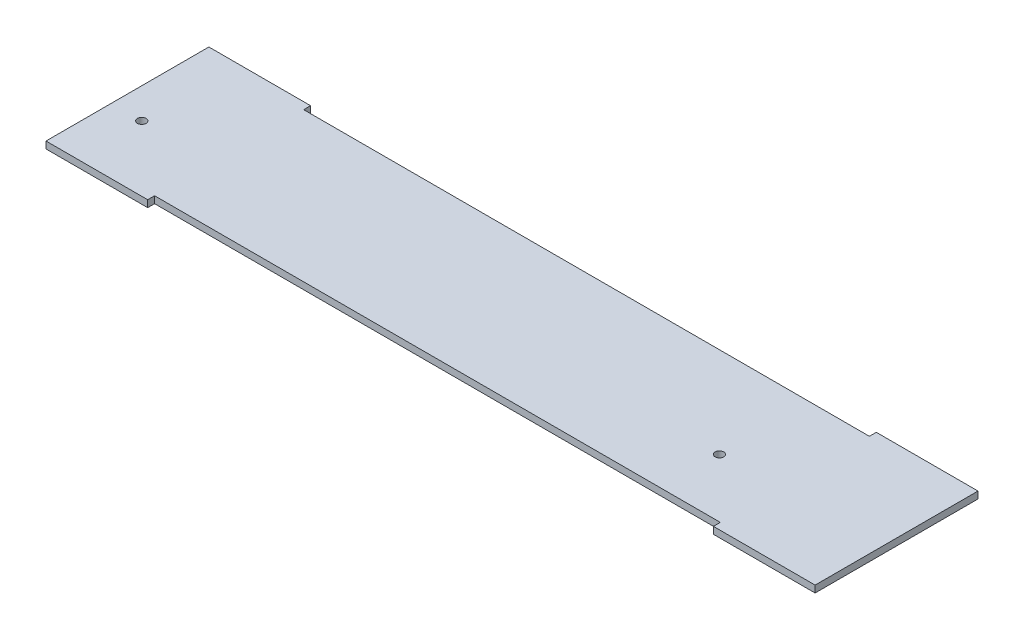
ISO-10303-21;
HEADER;
FILE_DESCRIPTION(('STEP AP214'),'2;1');
FILE_NAME('part.step','',(''),(''),'','','');
FILE_SCHEMA(('AUTOMOTIVE_DESIGN { 1 0 10303 214 1 1 1 1 }'));
ENDSEC;
DATA;
#1=APPLICATION_CONTEXT('core data for automotive mechanical design processes');
#2=APPLICATION_PROTOCOL_DEFINITION('international standard','automotive_design',2000,#1);
#3=PRODUCT_CONTEXT('',#1,'mechanical');
#4=PRODUCT('Part','Part','',(#3));
#5=PRODUCT_RELATED_PRODUCT_CATEGORY('part','',(#4));
#6=PRODUCT_DEFINITION_FORMATION('','',#4);
#7=PRODUCT_DEFINITION_CONTEXT('part definition',#1,'design');
#8=PRODUCT_DEFINITION('design','',#6,#7);
#9=PRODUCT_DEFINITION_SHAPE('','',#8);
#10=(LENGTH_UNIT() NAMED_UNIT(*) SI_UNIT(.MILLI.,.METRE.));
#11=(NAMED_UNIT(*) PLANE_ANGLE_UNIT() SI_UNIT($,.RADIAN.));
#12=(NAMED_UNIT(*) SI_UNIT($,.STERADIAN.) SOLID_ANGLE_UNIT());
#13=UNCERTAINTY_MEASURE_WITH_UNIT(LENGTH_MEASURE(1.E-05),#10,'distance_accuracy_value','');
#14=(GEOMETRIC_REPRESENTATION_CONTEXT(3) GLOBAL_UNCERTAINTY_ASSIGNED_CONTEXT((#13)) GLOBAL_UNIT_ASSIGNED_CONTEXT((#10,
#11,#12)) REPRESENTATION_CONTEXT('',''));
#15=CARTESIAN_POINT('',(0.,0.,0.));
#16=DIRECTION('',(0.,0.,1.));
#17=DIRECTION('',(1.,0.,0.));
#18=AXIS2_PLACEMENT_3D('',#15,#16,#17);
#19=CARTESIAN_POINT('',(-260.5,3.175,-74.9999999999999));
#20=DIRECTION('',(0.,0.,1.));
#21=DIRECTION('',(1.,0.,0.));
#22=AXIS2_PLACEMENT_3D('',#19,#20,#21);
#23=PLANE('',#22);
#24=DIRECTION('',(-1.,0.,0.));
#25=VECTOR('',#24,1.);
#26=CARTESIAN_POINT('',(-260.5,-3.175,-74.9999999999999));
#27=LINE('',#26,#25);
#28=CARTESIAN_POINT('',(-260.5,-3.175,-74.9999999999999));
#29=VERTEX_POINT('',#28);
#30=CARTESIAN_POINT('',(-354.15,-3.175,-75.));
#31=VERTEX_POINT('',#30);
#32=EDGE_CURVE('E153',#29,#31,#27,.T.);
#33=ORIENTED_EDGE('',*,*,#32,.T.);
#34=DIRECTION('',(0.,-1.,0.));
#35=VECTOR('',#34,1.);
#36=CARTESIAN_POINT('',(-354.15,3.175,-75.));
#37=LINE('',#36,#35);
#38=CARTESIAN_POINT('',(-354.15,3.175,-75.));
#39=VERTEX_POINT('',#38);
#40=EDGE_CURVE('E11',#39,#31,#37,.T.);
#41=ORIENTED_EDGE('',*,*,#40,.F.);
#42=DIRECTION('',(-1.,0.,0.));
#43=VECTOR('',#42,1.);
#44=CARTESIAN_POINT('',(-260.5,3.175,-74.9999999999999));
#45=LINE('',#44,#43);
#46=CARTESIAN_POINT('',(-260.5,3.175,-74.9999999999999));
#47=VERTEX_POINT('',#46);
#48=EDGE_CURVE('E176',#47,#39,#45,.T.);
#49=ORIENTED_EDGE('',*,*,#48,.F.);
#50=DIRECTION('',(0.,-1.,0.));
#51=VECTOR('',#50,1.);
#52=CARTESIAN_POINT('',(-260.5,3.175,-74.9999999999999));
#53=LINE('',#52,#51);
#54=EDGE_CURVE('E149',#47,#29,#53,.T.);
#55=ORIENTED_EDGE('',*,*,#54,.T.);
#56=EDGE_LOOP('',(#33,#41,#49,#55));
#57=FACE_BOUND('',#56,.T.);
#58=ADVANCED_FACE('F33',(#57),#23,.F.);
#59=CARTESIAN_POINT('',(-354.15,3.175,-75.));
#60=DIRECTION('',(1.,0.,0.));
#61=DIRECTION('',(0.,0.,-1.));
#62=AXIS2_PLACEMENT_3D('',#59,#60,#61);
#63=PLANE('',#62);
#64=DIRECTION('',(0.,0.,1.));
#65=VECTOR('',#64,1.);
#66=CARTESIAN_POINT('',(-354.15,-3.175,-75.));
#67=LINE('',#66,#65);
#68=CARTESIAN_POINT('',(-354.15,-3.175,75.));
#69=VERTEX_POINT('',#68);
#70=EDGE_CURVE('E156',#31,#69,#67,.T.);
#71=ORIENTED_EDGE('',*,*,#70,.T.);
#72=DIRECTION('',(0.,-1.,0.));
#73=VECTOR('',#72,1.);
#74=CARTESIAN_POINT('',(-354.15,3.175,75.));
#75=LINE('',#74,#73);
#76=CARTESIAN_POINT('',(-354.15,3.175,75.));
#77=VERTEX_POINT('',#76);
#78=EDGE_CURVE('E41',#77,#69,#75,.T.);
#79=ORIENTED_EDGE('',*,*,#78,.F.);
#80=DIRECTION('',(0.,0.,1.));
#81=VECTOR('',#80,1.);
#82=CARTESIAN_POINT('',(-354.15,3.175,-75.));
#83=LINE('',#82,#81);
#84=EDGE_CURVE('E104',#39,#77,#83,.T.);
#85=ORIENTED_EDGE('',*,*,#84,.F.);
#86=ORIENTED_EDGE('',*,*,#40,.T.);
#87=EDGE_LOOP('',(#71,#79,#85,#86));
#88=FACE_BOUND('',#87,.T.);
#89=ADVANCED_FACE('F255',(#88),#63,.F.);
#90=CARTESIAN_POINT('',(-354.15,3.175,75.));
#91=DIRECTION('',(0.,0.,-1.));
#92=DIRECTION('',(-1.,0.,0.));
#93=AXIS2_PLACEMENT_3D('',#90,#91,#92);
#94=PLANE('',#93);
#95=DIRECTION('',(1.,0.,0.));
#96=VECTOR('',#95,1.);
#97=CARTESIAN_POINT('',(-354.15,-3.175,75.));
#98=LINE('',#97,#96);
#99=CARTESIAN_POINT('',(-260.5,-3.175,74.9999999999999));
#100=VERTEX_POINT('',#99);
#101=EDGE_CURVE('E159',#69,#100,#98,.T.);
#102=ORIENTED_EDGE('',*,*,#101,.T.);
#103=DIRECTION('',(0.,-1.,0.));
#104=VECTOR('',#103,1.);
#105=CARTESIAN_POINT('',(-260.5,3.175,74.9999999999999));
#106=LINE('',#105,#104);
#107=CARTESIAN_POINT('',(-260.5,3.175,74.9999999999999));
#108=VERTEX_POINT('',#107);
#109=EDGE_CURVE('E195',#108,#100,#106,.T.);
#110=ORIENTED_EDGE('',*,*,#109,.F.);
#111=DIRECTION('',(1.,0.,0.));
#112=VECTOR('',#111,1.);
#113=CARTESIAN_POINT('',(-354.15,3.175,75.));
#114=LINE('',#113,#112);
#115=EDGE_CURVE('E203',#77,#108,#114,.T.);
#116=ORIENTED_EDGE('',*,*,#115,.F.);
#117=ORIENTED_EDGE('',*,*,#78,.T.);
#118=EDGE_LOOP('',(#102,#110,#116,#117));
#119=FACE_BOUND('',#118,.T.);
#120=ADVANCED_FACE('F201',(#119),#94,.F.);
#121=CARTESIAN_POINT('',(-260.5,3.175,74.9999999999999));
#122=DIRECTION('',(-1.,0.,0.));
#123=DIRECTION('',(0.,0.,1.));
#124=AXIS2_PLACEMENT_3D('',#121,#122,#123);
#125=PLANE('',#124);
#126=DIRECTION('',(0.,0.,-1.));
#127=VECTOR('',#126,1.);
#128=CARTESIAN_POINT('',(-260.5,-3.175,74.9999999999999));
#129=LINE('',#128,#127);
#130=CARTESIAN_POINT('',(-260.5,-3.175,68.6499999999999));
#131=VERTEX_POINT('',#130);
#132=EDGE_CURVE('E161',#100,#131,#129,.T.);
#133=ORIENTED_EDGE('',*,*,#132,.T.);
#134=DIRECTION('',(0.,-1.,0.));
#135=VECTOR('',#134,1.);
#136=CARTESIAN_POINT('',(-260.5,3.175,68.6499999999999));
#137=LINE('',#136,#135);
#138=CARTESIAN_POINT('',(-260.5,3.175,68.6499999999999));
#139=VERTEX_POINT('',#138);
#140=EDGE_CURVE('E192',#139,#131,#137,.T.);
#141=ORIENTED_EDGE('',*,*,#140,.F.);
#142=DIRECTION('',(0.,0.,-1.));
#143=VECTOR('',#142,1.);
#144=CARTESIAN_POINT('',(-260.5,3.175,74.9999999999999));
#145=LINE('',#144,#143);
#146=EDGE_CURVE('E221',#108,#139,#145,.T.);
#147=ORIENTED_EDGE('',*,*,#146,.F.);
#148=ORIENTED_EDGE('',*,*,#109,.T.);
#149=EDGE_LOOP('',(#133,#141,#147,#148));
#150=FACE_BOUND('',#149,.T.);
#151=ADVANCED_FACE('F212',(#150),#125,.F.);
#152=CARTESIAN_POINT('',(-260.5,3.175,68.6499999999999));
#153=DIRECTION('',(0.,0.,-1.));
#154=DIRECTION('',(-1.,0.,0.));
#155=AXIS2_PLACEMENT_3D('',#152,#153,#154);
#156=PLANE('',#155);
#157=DIRECTION('',(1.,0.,0.));
#158=VECTOR('',#157,1.);
#159=CARTESIAN_POINT('',(-260.5,-3.175,68.6499999999999));
#160=LINE('',#159,#158);
#161=CARTESIAN_POINT('',(260.5,-3.175,68.6499999999999));
#162=VERTEX_POINT('',#161);
#163=EDGE_CURVE('E163',#131,#162,#160,.T.);
#164=ORIENTED_EDGE('',*,*,#163,.T.);
#165=DIRECTION('',(0.,-1.,0.));
#166=VECTOR('',#165,1.);
#167=CARTESIAN_POINT('',(260.5,3.175,68.6499999999999));
#168=LINE('',#167,#166);
#169=CARTESIAN_POINT('',(260.5,3.175,68.6499999999999));
#170=VERTEX_POINT('',#169);
#171=EDGE_CURVE('E189',#170,#162,#168,.T.);
#172=ORIENTED_EDGE('',*,*,#171,.F.);
#173=DIRECTION('',(1.,0.,0.));
#174=VECTOR('',#173,1.);
#175=CARTESIAN_POINT('',(-260.5,3.175,68.6499999999999));
#176=LINE('',#175,#174);
#177=EDGE_CURVE('E218',#139,#170,#176,.T.);
#178=ORIENTED_EDGE('',*,*,#177,.F.);
#179=ORIENTED_EDGE('',*,*,#140,.T.);
#180=EDGE_LOOP('',(#164,#172,#178,#179));
#181=FACE_BOUND('',#180,.T.);
#182=ADVANCED_FACE('F216',(#181),#156,.F.);
#183=CARTESIAN_POINT('',(260.5,3.175,68.6499999999999));
#184=DIRECTION('',(1.,0.,0.));
#185=DIRECTION('',(0.,0.,-1.));
#186=AXIS2_PLACEMENT_3D('',#183,#184,#185);
#187=PLANE('',#186);
#188=DIRECTION('',(0.,0.,1.));
#189=VECTOR('',#188,1.);
#190=CARTESIAN_POINT('',(260.5,-3.175,68.6499999999999));
#191=LINE('',#190,#189);
#192=CARTESIAN_POINT('',(260.5,-3.175,74.9999999999999));
#193=VERTEX_POINT('',#192);
#194=EDGE_CURVE('E165',#162,#193,#191,.T.);
#195=ORIENTED_EDGE('',*,*,#194,.T.);
#196=DIRECTION('',(0.,-1.,0.));
#197=VECTOR('',#196,1.);
#198=CARTESIAN_POINT('',(260.5,3.175,74.9999999999999));
#199=LINE('',#198,#197);
#200=CARTESIAN_POINT('',(260.5,3.175,74.9999999999999));
#201=VERTEX_POINT('',#200);
#202=EDGE_CURVE('E186',#201,#193,#199,.T.);
#203=ORIENTED_EDGE('',*,*,#202,.F.);
#204=DIRECTION('',(0.,0.,1.));
#205=VECTOR('',#204,1.);
#206=CARTESIAN_POINT('',(260.5,3.175,68.6499999999999));
#207=LINE('',#206,#205);
#208=EDGE_CURVE('E220',#170,#201,#207,.T.);
#209=ORIENTED_EDGE('',*,*,#208,.F.);
#210=ORIENTED_EDGE('',*,*,#171,.T.);
#211=EDGE_LOOP('',(#195,#203,#209,#210));
#212=FACE_BOUND('',#211,.T.);
#213=ADVANCED_FACE('F268',(#212),#187,.F.);
#214=CARTESIAN_POINT('',(260.5,3.175,74.9999999999999));
#215=DIRECTION('',(0.,0.,-1.));
#216=DIRECTION('',(-1.,0.,0.));
#217=AXIS2_PLACEMENT_3D('',#214,#215,#216);
#218=PLANE('',#217);
#219=DIRECTION('',(1.,0.,0.));
#220=VECTOR('',#219,1.);
#221=CARTESIAN_POINT('',(260.5,-3.175,74.9999999999999));
#222=LINE('',#221,#220);
#223=CARTESIAN_POINT('',(354.15,-3.175,75.));
#224=VERTEX_POINT('',#223);
#225=EDGE_CURVE('E167',#193,#224,#222,.T.);
#226=ORIENTED_EDGE('',*,*,#225,.T.);
#227=DIRECTION('',(0.,-1.,0.));
#228=VECTOR('',#227,1.);
#229=CARTESIAN_POINT('',(354.15,3.175,75.));
#230=LINE('',#229,#228);
#231=CARTESIAN_POINT('',(354.15,3.175,75.));
#232=VERTEX_POINT('',#231);
#233=EDGE_CURVE('E183',#232,#224,#230,.T.);
#234=ORIENTED_EDGE('',*,*,#233,.F.);
#235=DIRECTION('',(1.,0.,0.));
#236=VECTOR('',#235,1.);
#237=CARTESIAN_POINT('',(260.5,3.175,74.9999999999999));
#238=LINE('',#237,#236);
#239=EDGE_CURVE('E223',#201,#232,#238,.T.);
#240=ORIENTED_EDGE('',*,*,#239,.F.);
#241=ORIENTED_EDGE('',*,*,#202,.T.);
#242=EDGE_LOOP('',(#226,#234,#240,#241));
#243=FACE_BOUND('',#242,.T.);
#244=ADVANCED_FACE('F271',(#243),#218,.F.);
#245=CARTESIAN_POINT('',(354.15,3.175,75.));
#246=DIRECTION('',(-1.,0.,0.));
#247=DIRECTION('',(0.,0.,1.));
#248=AXIS2_PLACEMENT_3D('',#245,#246,#247);
#249=PLANE('',#248);
#250=DIRECTION('',(0.,0.,-1.));
#251=VECTOR('',#250,1.);
#252=CARTESIAN_POINT('',(354.15,-3.175,75.));
#253=LINE('',#252,#251);
#254=CARTESIAN_POINT('',(354.15,-3.175,-75.));
#255=VERTEX_POINT('',#254);
#256=EDGE_CURVE('E169',#224,#255,#253,.T.);
#257=ORIENTED_EDGE('',*,*,#256,.T.);
#258=DIRECTION('',(0.,-1.,0.));
#259=VECTOR('',#258,1.);
#260=CARTESIAN_POINT('',(354.15,3.175,-75.));
#261=LINE('',#260,#259);
#262=CARTESIAN_POINT('',(354.15,3.175,-75.));
#263=VERTEX_POINT('',#262);
#264=EDGE_CURVE('E180',#263,#255,#261,.T.);
#265=ORIENTED_EDGE('',*,*,#264,.F.);
#266=DIRECTION('',(0.,0.,-1.));
#267=VECTOR('',#266,1.);
#268=CARTESIAN_POINT('',(354.15,3.175,75.));
#269=LINE('',#268,#267);
#270=EDGE_CURVE('E229',#232,#263,#269,.T.);
#271=ORIENTED_EDGE('',*,*,#270,.F.);
#272=ORIENTED_EDGE('',*,*,#233,.T.);
#273=EDGE_LOOP('',(#257,#265,#271,#272));
#274=FACE_BOUND('',#273,.T.);
#275=ADVANCED_FACE('F235',(#274),#249,.F.);
#276=CARTESIAN_POINT('',(354.15,3.175,-75.));
#277=DIRECTION('',(0.,0.,1.));
#278=DIRECTION('',(1.,0.,0.));
#279=AXIS2_PLACEMENT_3D('',#276,#277,#278);
#280=PLANE('',#279);
#281=DIRECTION('',(-1.,0.,0.));
#282=VECTOR('',#281,1.);
#283=CARTESIAN_POINT('',(354.15,-3.175,-75.));
#284=LINE('',#283,#282);
#285=CARTESIAN_POINT('',(260.5,-3.175,-74.9999999999999));
#286=VERTEX_POINT('',#285);
#287=EDGE_CURVE('E171',#255,#286,#284,.T.);
#288=ORIENTED_EDGE('',*,*,#287,.T.);
#289=DIRECTION('',(0.,-1.,0.));
#290=VECTOR('',#289,1.);
#291=CARTESIAN_POINT('',(260.5,3.175,-74.9999999999999));
#292=LINE('',#291,#290);
#293=CARTESIAN_POINT('',(260.5,3.175,-74.9999999999999));
#294=VERTEX_POINT('',#293);
#295=EDGE_CURVE('E144',#294,#286,#292,.T.);
#296=ORIENTED_EDGE('',*,*,#295,.F.);
#297=DIRECTION('',(-1.,0.,0.));
#298=VECTOR('',#297,1.);
#299=CARTESIAN_POINT('',(354.15,3.175,-75.));
#300=LINE('',#299,#298);
#301=EDGE_CURVE('E135',#263,#294,#300,.T.);
#302=ORIENTED_EDGE('',*,*,#301,.F.);
#303=ORIENTED_EDGE('',*,*,#264,.T.);
#304=EDGE_LOOP('',(#288,#296,#302,#303));
#305=FACE_BOUND('',#304,.T.);
#306=ADVANCED_FACE('F239',(#305),#280,.F.);
#307=CARTESIAN_POINT('',(260.5,3.175,-74.9999999999999));
#308=DIRECTION('',(1.,0.,0.));
#309=DIRECTION('',(0.,0.,-1.));
#310=AXIS2_PLACEMENT_3D('',#307,#308,#309);
#311=PLANE('',#310);
#312=DIRECTION('',(0.,0.,1.));
#313=VECTOR('',#312,1.);
#314=CARTESIAN_POINT('',(260.5,-3.175,-74.9999999999999));
#315=LINE('',#314,#313);
#316=CARTESIAN_POINT('',(260.5,-3.175,-68.6499999999999));
#317=VERTEX_POINT('',#316);
#318=EDGE_CURVE('E143',#286,#317,#315,.T.);
#319=ORIENTED_EDGE('',*,*,#318,.T.);
#320=DIRECTION('',(0.,-1.,0.));
#321=VECTOR('',#320,1.);
#322=CARTESIAN_POINT('',(260.5,3.175,-68.6499999999999));
#323=LINE('',#322,#321);
#324=CARTESIAN_POINT('',(260.5,3.175,-68.6499999999999));
#325=VERTEX_POINT('',#324);
#326=EDGE_CURVE('E140',#325,#317,#323,.T.);
#327=ORIENTED_EDGE('',*,*,#326,.F.);
#328=DIRECTION('',(0.,0.,1.));
#329=VECTOR('',#328,1.);
#330=CARTESIAN_POINT('',(260.5,3.175,-74.9999999999999));
#331=LINE('',#330,#329);
#332=EDGE_CURVE('E129',#294,#325,#331,.T.);
#333=ORIENTED_EDGE('',*,*,#332,.F.);
#334=ORIENTED_EDGE('',*,*,#295,.T.);
#335=EDGE_LOOP('',(#319,#327,#333,#334));
#336=FACE_BOUND('',#335,.T.);
#337=ADVANCED_FACE('F141',(#336),#311,.F.);
#338=CARTESIAN_POINT('',(260.5,3.175,-68.6499999999999));
#339=DIRECTION('',(0.,0.,1.));
#340=DIRECTION('',(1.,0.,0.));
#341=AXIS2_PLACEMENT_3D('',#338,#339,#340);
#342=PLANE('',#341);
#343=DIRECTION('',(-1.,0.,0.));
#344=VECTOR('',#343,1.);
#345=CARTESIAN_POINT('',(260.5,-3.175,-68.6499999999999));
#346=LINE('',#345,#344);
#347=CARTESIAN_POINT('',(-260.5,-3.175,-68.6499999999999));
#348=VERTEX_POINT('',#347);
#349=EDGE_CURVE('E90',#317,#348,#346,.T.);
#350=ORIENTED_EDGE('',*,*,#349,.T.);
#351=DIRECTION('',(0.,-1.,0.));
#352=VECTOR('',#351,1.);
#353=CARTESIAN_POINT('',(-260.5,3.175,-68.6499999999999));
#354=LINE('',#353,#352);
#355=CARTESIAN_POINT('',(-260.5,3.175,-68.6499999999999));
#356=VERTEX_POINT('',#355);
#357=EDGE_CURVE('E145',#356,#348,#354,.T.);
#358=ORIENTED_EDGE('',*,*,#357,.F.);
#359=DIRECTION('',(-1.,0.,0.));
#360=VECTOR('',#359,1.);
#361=CARTESIAN_POINT('',(260.5,3.175,-68.6499999999999));
#362=LINE('',#361,#360);
#363=EDGE_CURVE('E133',#325,#356,#362,.T.);
#364=ORIENTED_EDGE('',*,*,#363,.F.);
#365=ORIENTED_EDGE('',*,*,#326,.T.);
#366=EDGE_LOOP('',(#350,#358,#364,#365));
#367=FACE_BOUND('',#366,.T.);
#368=ADVANCED_FACE('F147',(#367),#342,.F.);
#369=CARTESIAN_POINT('',(-260.5,3.175,-68.6499999999999));
#370=DIRECTION('',(-1.,0.,0.));
#371=DIRECTION('',(0.,0.,1.));
#372=AXIS2_PLACEMENT_3D('',#369,#370,#371);
#373=PLANE('',#372);
#374=DIRECTION('',(0.,0.,-1.));
#375=VECTOR('',#374,1.);
#376=CARTESIAN_POINT('',(-260.5,-3.175,-68.6499999999999));
#377=LINE('',#376,#375);
#378=EDGE_CURVE('E96',#348,#29,#377,.T.);
#379=ORIENTED_EDGE('',*,*,#378,.T.);
#380=ORIENTED_EDGE('',*,*,#54,.F.);
#381=DIRECTION('',(0.,0.,-1.));
#382=VECTOR('',#381,1.);
#383=CARTESIAN_POINT('',(-260.5,3.175,-68.6499999999999));
#384=LINE('',#383,#382);
#385=EDGE_CURVE('E49',#356,#47,#384,.T.);
#386=ORIENTED_EDGE('',*,*,#385,.F.);
#387=ORIENTED_EDGE('',*,*,#357,.T.);
#388=EDGE_LOOP('',(#379,#380,#386,#387));
#389=FACE_BOUND('',#388,.T.);
#390=ADVANCED_FACE('F243',(#389),#373,.F.);
#391=CARTESIAN_POINT('',(0.,3.175,0.));
#392=DIRECTION('',(0.,1.,0.));
#393=DIRECTION('',(0.,0.,1.));
#394=AXIS2_PLACEMENT_3D('',#391,#392,#393);
#395=PLANE('',#394);
#396=CARTESIAN_POINT('',(-326.1,3.175,14.8499999999993));
#397=DIRECTION('',(0.,-1.,0.));
#398=DIRECTION('',(0.,0.,-1.));
#399=AXIS2_PLACEMENT_3D('',#396,#397,#398);
#400=CIRCLE('',#399,3.99999999999999);
#401=CARTESIAN_POINT('',(-326.1,3.175,10.8499999999993));
#402=VERTEX_POINT('',#401);
#403=EDGE_CURVE('E157',#402,#402,#400,.T.);
#404=ORIENTED_EDGE('',*,*,#403,.T.);
#405=EDGE_LOOP('',(#404));
#406=FACE_BOUND('',#405,.T.);
#407=CARTESIAN_POINT('',(205.9,3.175,14.8499999999993));
#408=DIRECTION('',(0.,-1.,0.));
#409=DIRECTION('',(0.,0.,-1.));
#410=AXIS2_PLACEMENT_3D('',#407,#408,#409);
#411=CIRCLE('',#410,3.99999999999999);
#412=CARTESIAN_POINT('',(205.9,3.175,10.8499999999993));
#413=VERTEX_POINT('',#412);
#414=EDGE_CURVE('E337',#413,#413,#411,.T.);
#415=ORIENTED_EDGE('',*,*,#414,.T.);
#416=EDGE_LOOP('',(#415));
#417=FACE_BOUND('',#416,.T.);
#418=ORIENTED_EDGE('',*,*,#48,.T.);
#419=ORIENTED_EDGE('',*,*,#84,.T.);
#420=ORIENTED_EDGE('',*,*,#115,.T.);
#421=ORIENTED_EDGE('',*,*,#146,.T.);
#422=ORIENTED_EDGE('',*,*,#177,.T.);
#423=ORIENTED_EDGE('',*,*,#208,.T.);
#424=ORIENTED_EDGE('',*,*,#239,.T.);
#425=ORIENTED_EDGE('',*,*,#270,.T.);
#426=ORIENTED_EDGE('',*,*,#301,.T.);
#427=ORIENTED_EDGE('',*,*,#332,.T.);
#428=ORIENTED_EDGE('',*,*,#363,.T.);
#429=ORIENTED_EDGE('',*,*,#385,.T.);
#430=EDGE_LOOP('',(#418,#419,#420,#421,#422,#423,#424,#425,#426,#427,#428,#429));
#431=FACE_BOUND('',#430,.T.);
#432=ADVANCED_FACE('F131',(#406,#417,#431),#395,.T.);
#433=CARTESIAN_POINT('',(0.,-3.175,0.));
#434=DIRECTION('',(0.,1.,0.));
#435=DIRECTION('',(0.,0.,1.));
#436=AXIS2_PLACEMENT_3D('',#433,#434,#435);
#437=PLANE('',#436);
#438=CARTESIAN_POINT('',(-326.1,-3.175,14.8499999999993));
#439=DIRECTION('',(0.,-1.,0.));
#440=DIRECTION('',(0.,0.,-1.));
#441=AXIS2_PLACEMENT_3D('',#438,#439,#440);
#442=CIRCLE('',#441,3.99999999999999);
#443=CARTESIAN_POINT('',(-326.1,-3.175,10.8499999999993));
#444=VERTEX_POINT('',#443);
#445=EDGE_CURVE('E336',#444,#444,#442,.T.);
#446=ORIENTED_EDGE('',*,*,#445,.F.);
#447=EDGE_LOOP('',(#446));
#448=FACE_BOUND('',#447,.T.);
#449=CARTESIAN_POINT('',(205.9,-3.175,14.8499999999993));
#450=DIRECTION('',(0.,-1.,0.));
#451=DIRECTION('',(0.,0.,-1.));
#452=AXIS2_PLACEMENT_3D('',#449,#450,#451);
#453=CIRCLE('',#452,3.99999999999999);
#454=CARTESIAN_POINT('',(205.9,-3.175,10.8499999999993));
#455=VERTEX_POINT('',#454);
#456=EDGE_CURVE('E341',#455,#455,#453,.T.);
#457=ORIENTED_EDGE('',*,*,#456,.F.);
#458=EDGE_LOOP('',(#457));
#459=FACE_BOUND('',#458,.T.);
#460=ORIENTED_EDGE('',*,*,#32,.F.);
#461=ORIENTED_EDGE('',*,*,#378,.F.);
#462=ORIENTED_EDGE('',*,*,#349,.F.);
#463=ORIENTED_EDGE('',*,*,#318,.F.);
#464=ORIENTED_EDGE('',*,*,#287,.F.);
#465=ORIENTED_EDGE('',*,*,#256,.F.);
#466=ORIENTED_EDGE('',*,*,#225,.F.);
#467=ORIENTED_EDGE('',*,*,#194,.F.);
#468=ORIENTED_EDGE('',*,*,#163,.F.);
#469=ORIENTED_EDGE('',*,*,#132,.F.);
#470=ORIENTED_EDGE('',*,*,#101,.F.);
#471=ORIENTED_EDGE('',*,*,#70,.F.);
#472=EDGE_LOOP('',(#460,#461,#462,#463,#464,#465,#466,#467,#468,#469,#470,#471));
#473=FACE_BOUND('',#472,.T.);
#474=ADVANCED_FACE('F207',(#448,#459,#473),#437,.F.);
#475=CARTESIAN_POINT('',(205.9,3.175,14.8499999999993));
#476=DIRECTION('',(0.,-1.,0.));
#477=DIRECTION('',(0.,0.,-1.));
#478=AXIS2_PLACEMENT_3D('',#475,#476,#477);
#479=CYLINDRICAL_SURFACE('',#478,3.99999999999999);
#480=ORIENTED_EDGE('',*,*,#414,.F.);
#481=EDGE_LOOP('',(#480));
#482=FACE_BOUND('',#481,.T.);
#483=ORIENTED_EDGE('',*,*,#456,.T.);
#484=EDGE_LOOP('',(#483));
#485=FACE_BOUND('',#484,.T.);
#486=ADVANCED_FACE('F308',(#482,#485),#479,.F.);
#487=CARTESIAN_POINT('',(-326.1,3.175,14.8499999999993));
#488=DIRECTION('',(0.,-1.,0.));
#489=DIRECTION('',(0.,0.,-1.));
#490=AXIS2_PLACEMENT_3D('',#487,#488,#489);
#491=CYLINDRICAL_SURFACE('',#490,3.99999999999999);
#492=ORIENTED_EDGE('',*,*,#403,.F.);
#493=EDGE_LOOP('',(#492));
#494=FACE_BOUND('',#493,.T.);
#495=ORIENTED_EDGE('',*,*,#445,.T.);
#496=EDGE_LOOP('',(#495));
#497=FACE_BOUND('',#496,.T.);
#498=ADVANCED_FACE('F317',(#494,#497),#491,.F.);
#499=CLOSED_SHELL('',(#58,#89,#120,#151,#182,#213,#244,#275,#306,#337,#368,#390,#432,#474,#486,#498));
#500=MANIFOLD_SOLID_BREP('B2',#499);
#501=ADVANCED_BREP_SHAPE_REPRESENTATION('',(#18,#500),#14);
#502=SHAPE_DEFINITION_REPRESENTATION(#9,#501);
ENDSEC;
END-ISO-10303-21;
